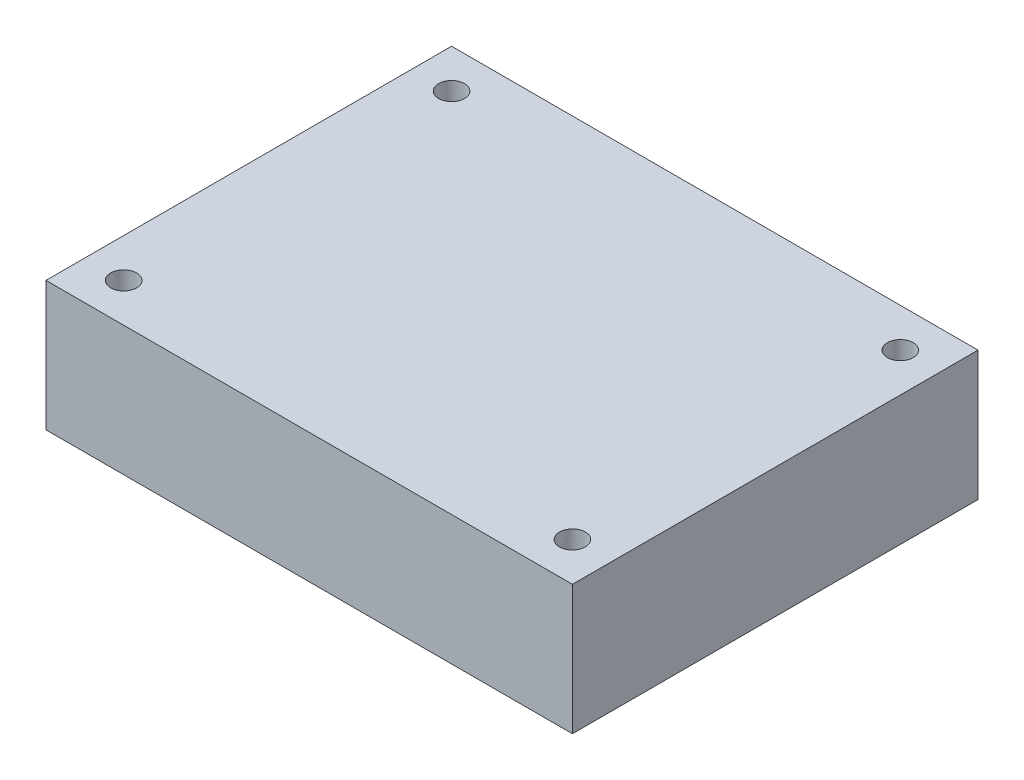
ISO-10303-21;
HEADER;
FILE_DESCRIPTION(('STEP AP214'),'2;1');
FILE_NAME('part.step','',(''),(''),'','','');
FILE_SCHEMA(('AUTOMOTIVE_DESIGN { 1 0 10303 214 1 1 1 1 }'));
ENDSEC;
DATA;
#1=APPLICATION_CONTEXT('core data for automotive mechanical design processes');
#2=APPLICATION_PROTOCOL_DEFINITION('international standard','automotive_design',2000,#1);
#3=PRODUCT_CONTEXT('',#1,'mechanical');
#4=PRODUCT('Part','Part','',(#3));
#5=PRODUCT_RELATED_PRODUCT_CATEGORY('part','',(#4));
#6=PRODUCT_DEFINITION_FORMATION('','',#4);
#7=PRODUCT_DEFINITION_CONTEXT('part definition',#1,'design');
#8=PRODUCT_DEFINITION('design','',#6,#7);
#9=PRODUCT_DEFINITION_SHAPE('','',#8);
#10=(LENGTH_UNIT() NAMED_UNIT(*) SI_UNIT(.MILLI.,.METRE.));
#11=(NAMED_UNIT(*) PLANE_ANGLE_UNIT() SI_UNIT($,.RADIAN.));
#12=(NAMED_UNIT(*) SI_UNIT($,.STERADIAN.) SOLID_ANGLE_UNIT());
#13=UNCERTAINTY_MEASURE_WITH_UNIT(LENGTH_MEASURE(1.E-05),#10,'distance_accuracy_value','');
#14=(GEOMETRIC_REPRESENTATION_CONTEXT(3) GLOBAL_UNCERTAINTY_ASSIGNED_CONTEXT((#13)) GLOBAL_UNIT_ASSIGNED_CONTEXT((#10,
#11,#12)) REPRESENTATION_CONTEXT('',''));
#15=CARTESIAN_POINT('',(0.,0.,0.));
#16=DIRECTION('',(0.,0.,1.));
#17=DIRECTION('',(1.,0.,0.));
#18=AXIS2_PLACEMENT_3D('',#15,#16,#17);
#19=CARTESIAN_POINT('',(0.,15.,0.));
#20=DIRECTION('',(0.,-1.,0.));
#21=DIRECTION('',(0.,0.,-1.));
#22=AXIS2_PLACEMENT_3D('',#19,#20,#21);
#23=PLANE('',#22);
#24=DIRECTION('',(0.,0.,1.));
#25=VECTOR('',#24,1.);
#26=CARTESIAN_POINT('',(0.,15.,0.));
#27=LINE('',#26,#25);
#28=CARTESIAN_POINT('',(0.,15.,-47.));
#29=VERTEX_POINT('',#28);
#30=CARTESIAN_POINT('',(0.,15.,0.));
#31=VERTEX_POINT('',#30);
#32=EDGE_CURVE('E93',#29,#31,#27,.T.);
#33=ORIENTED_EDGE('',*,*,#32,.T.);
#34=DIRECTION('',(1.,0.,0.));
#35=VECTOR('',#34,1.);
#36=CARTESIAN_POINT('',(0.,15.,0.));
#37=LINE('',#36,#35);
#38=CARTESIAN_POINT('',(61.,15.,0.));
#39=VERTEX_POINT('',#38);
#40=EDGE_CURVE('E88',#31,#39,#37,.T.);
#41=ORIENTED_EDGE('',*,*,#40,.T.);
#42=DIRECTION('',(0.,0.,-1.));
#43=VECTOR('',#42,1.);
#44=CARTESIAN_POINT('',(61.,15.,0.));
#45=LINE('',#44,#43);
#46=CARTESIAN_POINT('',(61.,15.,-47.));
#47=VERTEX_POINT('',#46);
#48=EDGE_CURVE('E91',#39,#47,#45,.T.);
#49=ORIENTED_EDGE('',*,*,#48,.T.);
#50=DIRECTION('',(-1.,0.,0.));
#51=VECTOR('',#50,1.);
#52=CARTESIAN_POINT('',(0.,15.,-47.));
#53=LINE('',#52,#51);
#54=EDGE_CURVE('E58',#47,#29,#53,.T.);
#55=ORIENTED_EDGE('',*,*,#54,.T.);
#56=EDGE_LOOP('',(#33,#41,#49,#55));
#57=FACE_BOUND('',#56,.T.);
#58=CARTESIAN_POINT('',(4.5,15.,-42.5));
#59=DIRECTION('',(0.,1.,0.));
#60=DIRECTION('',(0.,0.,1.));
#61=AXIS2_PLACEMENT_3D('',#58,#59,#60);
#62=CIRCLE('',#61,1.5);
#63=CARTESIAN_POINT('',(4.5,15.,-41.));
#64=VERTEX_POINT('',#63);
#65=EDGE_CURVE('E108',#64,#64,#62,.T.);
#66=ORIENTED_EDGE('',*,*,#65,.F.);
#67=EDGE_LOOP('',(#66));
#68=FACE_BOUND('',#67,.T.);
#69=CARTESIAN_POINT('',(56.5,15.,-42.5));
#70=DIRECTION('',(0.,1.,0.));
#71=DIRECTION('',(0.,0.,1.));
#72=AXIS2_PLACEMENT_3D('',#69,#70,#71);
#73=CIRCLE('',#72,1.50107981201165);
#74=CARTESIAN_POINT('',(56.5,15.,-40.9989201879884));
#75=VERTEX_POINT('',#74);
#76=EDGE_CURVE('E123',#75,#75,#73,.T.);
#77=ORIENTED_EDGE('',*,*,#76,.F.);
#78=EDGE_LOOP('',(#77));
#79=FACE_BOUND('',#78,.T.);
#80=CARTESIAN_POINT('',(56.5,15.,-4.5));
#81=DIRECTION('',(0.,1.,0.));
#82=DIRECTION('',(0.,0.,1.));
#83=AXIS2_PLACEMENT_3D('',#80,#81,#82);
#84=CIRCLE('',#83,1.5);
#85=CARTESIAN_POINT('',(56.5,15.,-3.));
#86=VERTEX_POINT('',#85);
#87=EDGE_CURVE('E129',#86,#86,#84,.T.);
#88=ORIENTED_EDGE('',*,*,#87,.F.);
#89=EDGE_LOOP('',(#88));
#90=FACE_BOUND('',#89,.T.);
#91=CARTESIAN_POINT('',(4.5,15.,-4.5));
#92=DIRECTION('',(0.,1.,0.));
#93=DIRECTION('',(0.,0.,1.));
#94=AXIS2_PLACEMENT_3D('',#91,#92,#93);
#95=CIRCLE('',#94,1.5);
#96=CARTESIAN_POINT('',(4.5,15.,-3.));
#97=VERTEX_POINT('',#96);
#98=EDGE_CURVE('E135',#97,#97,#95,.T.);
#99=ORIENTED_EDGE('',*,*,#98,.F.);
#100=EDGE_LOOP('',(#99));
#101=FACE_BOUND('',#100,.T.);
#102=ADVANCED_FACE('F41',(#57,#68,#79,#90,#101),#23,.F.);
#103=CARTESIAN_POINT('',(0.,0.,0.));
#104=DIRECTION('',(0.,-1.,0.));
#105=DIRECTION('',(0.,0.,-1.));
#106=AXIS2_PLACEMENT_3D('',#103,#104,#105);
#107=PLANE('',#106);
#108=CARTESIAN_POINT('',(56.5,0.,-4.5));
#109=DIRECTION('',(0.,1.,0.));
#110=DIRECTION('',(0.,0.,1.));
#111=AXIS2_PLACEMENT_3D('',#108,#109,#110);
#112=CIRCLE('',#111,1.5);
#113=CARTESIAN_POINT('',(56.5,0.,-3.));
#114=VERTEX_POINT('',#113);
#115=EDGE_CURVE('E132',#114,#114,#112,.T.);
#116=ORIENTED_EDGE('',*,*,#115,.T.);
#117=EDGE_LOOP('',(#116));
#118=FACE_BOUND('',#117,.T.);
#119=CARTESIAN_POINT('',(4.5,0.,-42.5));
#120=DIRECTION('',(0.,1.,0.));
#121=DIRECTION('',(0.,0.,1.));
#122=AXIS2_PLACEMENT_3D('',#119,#120,#121);
#123=CIRCLE('',#122,1.5);
#124=CARTESIAN_POINT('',(4.5,0.,-41.));
#125=VERTEX_POINT('',#124);
#126=EDGE_CURVE('E120',#125,#125,#123,.T.);
#127=ORIENTED_EDGE('',*,*,#126,.T.);
#128=EDGE_LOOP('',(#127));
#129=FACE_BOUND('',#128,.T.);
#130=DIRECTION('',(0.,0.,1.));
#131=VECTOR('',#130,1.);
#132=CARTESIAN_POINT('',(0.,0.,0.));
#133=LINE('',#132,#131);
#134=CARTESIAN_POINT('',(0.,0.,-47.));
#135=VERTEX_POINT('',#134);
#136=CARTESIAN_POINT('',(0.,0.,0.));
#137=VERTEX_POINT('',#136);
#138=EDGE_CURVE('E105',#135,#137,#133,.T.);
#139=ORIENTED_EDGE('',*,*,#138,.F.);
#140=DIRECTION('',(-1.,0.,0.));
#141=VECTOR('',#140,1.);
#142=CARTESIAN_POINT('',(0.,0.,-47.));
#143=LINE('',#142,#141);
#144=CARTESIAN_POINT('',(61.,0.,-47.));
#145=VERTEX_POINT('',#144);
#146=EDGE_CURVE('E81',#145,#135,#143,.T.);
#147=ORIENTED_EDGE('',*,*,#146,.F.);
#148=DIRECTION('',(0.,0.,-1.));
#149=VECTOR('',#148,1.);
#150=CARTESIAN_POINT('',(61.,0.,0.));
#151=LINE('',#150,#149);
#152=CARTESIAN_POINT('',(61.,0.,0.));
#153=VERTEX_POINT('',#152);
#154=EDGE_CURVE('E75',#153,#145,#151,.T.);
#155=ORIENTED_EDGE('',*,*,#154,.F.);
#156=DIRECTION('',(1.,0.,0.));
#157=VECTOR('',#156,1.);
#158=CARTESIAN_POINT('',(0.,0.,0.));
#159=LINE('',#158,#157);
#160=EDGE_CURVE('E97',#137,#153,#159,.T.);
#161=ORIENTED_EDGE('',*,*,#160,.F.);
#162=EDGE_LOOP('',(#139,#147,#155,#161));
#163=FACE_BOUND('',#162,.T.);
#164=CARTESIAN_POINT('',(56.5,0.,-42.5));
#165=DIRECTION('',(0.,1.,0.));
#166=DIRECTION('',(0.,0.,1.));
#167=AXIS2_PLACEMENT_3D('',#164,#165,#166);
#168=CIRCLE('',#167,1.50107981201165);
#169=CARTESIAN_POINT('',(56.5,0.,-40.9989201879884));
#170=VERTEX_POINT('',#169);
#171=EDGE_CURVE('E126',#170,#170,#168,.T.);
#172=ORIENTED_EDGE('',*,*,#171,.T.);
#173=EDGE_LOOP('',(#172));
#174=FACE_BOUND('',#173,.T.);
#175=CARTESIAN_POINT('',(4.5,0.,-4.5));
#176=DIRECTION('',(0.,1.,0.));
#177=DIRECTION('',(0.,0.,1.));
#178=AXIS2_PLACEMENT_3D('',#175,#176,#177);
#179=CIRCLE('',#178,1.5);
#180=CARTESIAN_POINT('',(4.5,0.,-3.));
#181=VERTEX_POINT('',#180);
#182=EDGE_CURVE('E138',#181,#181,#179,.T.);
#183=ORIENTED_EDGE('',*,*,#182,.T.);
#184=EDGE_LOOP('',(#183));
#185=FACE_BOUND('',#184,.T.);
#186=ADVANCED_FACE('F116',(#118,#129,#163,#174,#185),#107,.T.);
#187=CARTESIAN_POINT('',(0.,15.,0.));
#188=DIRECTION('',(1.,0.,0.));
#189=DIRECTION('',(0.,0.,-1.));
#190=AXIS2_PLACEMENT_3D('',#187,#188,#189);
#191=PLANE('',#190);
#192=ORIENTED_EDGE('',*,*,#138,.T.);
#193=DIRECTION('',(0.,-1.,0.));
#194=VECTOR('',#193,1.);
#195=CARTESIAN_POINT('',(0.,15.,0.));
#196=LINE('',#195,#194);
#197=EDGE_CURVE('E11',#31,#137,#196,.T.);
#198=ORIENTED_EDGE('',*,*,#197,.F.);
#199=ORIENTED_EDGE('',*,*,#32,.F.);
#200=DIRECTION('',(0.,-1.,0.));
#201=VECTOR('',#200,1.);
#202=CARTESIAN_POINT('',(0.,15.,-47.));
#203=LINE('',#202,#201);
#204=EDGE_CURVE('E101',#29,#135,#203,.T.);
#205=ORIENTED_EDGE('',*,*,#204,.T.);
#206=EDGE_LOOP('',(#192,#198,#199,#205));
#207=FACE_BOUND('',#206,.T.);
#208=ADVANCED_FACE('F43',(#207),#191,.F.);
#209=CARTESIAN_POINT('',(0.,15.,0.));
#210=DIRECTION('',(0.,0.,-1.));
#211=DIRECTION('',(-1.,0.,0.));
#212=AXIS2_PLACEMENT_3D('',#209,#210,#211);
#213=PLANE('',#212);
#214=ORIENTED_EDGE('',*,*,#160,.T.);
#215=DIRECTION('',(0.,-1.,0.));
#216=VECTOR('',#215,1.);
#217=CARTESIAN_POINT('',(61.,15.,0.));
#218=LINE('',#217,#216);
#219=EDGE_CURVE('E50',#39,#153,#218,.T.);
#220=ORIENTED_EDGE('',*,*,#219,.F.);
#221=ORIENTED_EDGE('',*,*,#40,.F.);
#222=ORIENTED_EDGE('',*,*,#197,.T.);
#223=EDGE_LOOP('',(#214,#220,#221,#222));
#224=FACE_BOUND('',#223,.T.);
#225=ADVANCED_FACE('F96',(#224),#213,.F.);
#226=CARTESIAN_POINT('',(61.,15.,0.));
#227=DIRECTION('',(-1.,0.,0.));
#228=DIRECTION('',(0.,0.,1.));
#229=AXIS2_PLACEMENT_3D('',#226,#227,#228);
#230=PLANE('',#229);
#231=ORIENTED_EDGE('',*,*,#154,.T.);
#232=DIRECTION('',(0.,-1.,0.));
#233=VECTOR('',#232,1.);
#234=CARTESIAN_POINT('',(61.,15.,-47.));
#235=LINE('',#234,#233);
#236=EDGE_CURVE('E98',#47,#145,#235,.T.);
#237=ORIENTED_EDGE('',*,*,#236,.F.);
#238=ORIENTED_EDGE('',*,*,#48,.F.);
#239=ORIENTED_EDGE('',*,*,#219,.T.);
#240=EDGE_LOOP('',(#231,#237,#238,#239));
#241=FACE_BOUND('',#240,.T.);
#242=ADVANCED_FACE('F99',(#241),#230,.F.);
#243=CARTESIAN_POINT('',(0.,15.,-47.));
#244=DIRECTION('',(0.,0.,1.));
#245=DIRECTION('',(1.,0.,0.));
#246=AXIS2_PLACEMENT_3D('',#243,#244,#245);
#247=PLANE('',#246);
#248=ORIENTED_EDGE('',*,*,#146,.T.);
#249=ORIENTED_EDGE('',*,*,#204,.F.);
#250=ORIENTED_EDGE('',*,*,#54,.F.);
#251=ORIENTED_EDGE('',*,*,#236,.T.);
#252=EDGE_LOOP('',(#248,#249,#250,#251));
#253=FACE_BOUND('',#252,.T.);
#254=ADVANCED_FACE('F113',(#253),#247,.F.);
#255=CARTESIAN_POINT('',(4.5,15.,-42.5));
#256=DIRECTION('',(0.,-1.,0.));
#257=DIRECTION('',(0.,0.,-1.));
#258=AXIS2_PLACEMENT_3D('',#255,#256,#257);
#259=CYLINDRICAL_SURFACE('',#258,1.5);
#260=ORIENTED_EDGE('',*,*,#65,.T.);
#261=EDGE_LOOP('',(#260));
#262=FACE_BOUND('',#261,.T.);
#263=ORIENTED_EDGE('',*,*,#126,.F.);
#264=EDGE_LOOP('',(#263));
#265=FACE_BOUND('',#264,.T.);
#266=ADVANCED_FACE('F155',(#262,#265),#259,.F.);
#267=CARTESIAN_POINT('',(56.5,15.,-42.5));
#268=DIRECTION('',(0.,-1.,0.));
#269=DIRECTION('',(0.,0.,-1.));
#270=AXIS2_PLACEMENT_3D('',#267,#268,#269);
#271=CYLINDRICAL_SURFACE('',#270,1.50107981201165);
#272=ORIENTED_EDGE('',*,*,#76,.T.);
#273=EDGE_LOOP('',(#272));
#274=FACE_BOUND('',#273,.T.);
#275=ORIENTED_EDGE('',*,*,#171,.F.);
#276=EDGE_LOOP('',(#275));
#277=FACE_BOUND('',#276,.T.);
#278=ADVANCED_FACE('F200',(#274,#277),#271,.F.);
#279=CARTESIAN_POINT('',(56.5,15.,-4.5));
#280=DIRECTION('',(0.,-1.,0.));
#281=DIRECTION('',(0.,0.,-1.));
#282=AXIS2_PLACEMENT_3D('',#279,#280,#281);
#283=CYLINDRICAL_SURFACE('',#282,1.5);
#284=ORIENTED_EDGE('',*,*,#87,.T.);
#285=EDGE_LOOP('',(#284));
#286=FACE_BOUND('',#285,.T.);
#287=ORIENTED_EDGE('',*,*,#115,.F.);
#288=EDGE_LOOP('',(#287));
#289=FACE_BOUND('',#288,.T.);
#290=ADVANCED_FACE('F208',(#286,#289),#283,.F.);
#291=CARTESIAN_POINT('',(4.5,15.,-4.5));
#292=DIRECTION('',(0.,-1.,0.));
#293=DIRECTION('',(0.,0.,-1.));
#294=AXIS2_PLACEMENT_3D('',#291,#292,#293);
#295=CYLINDRICAL_SURFACE('',#294,1.5);
#296=ORIENTED_EDGE('',*,*,#98,.T.);
#297=EDGE_LOOP('',(#296));
#298=FACE_BOUND('',#297,.T.);
#299=ORIENTED_EDGE('',*,*,#182,.F.);
#300=EDGE_LOOP('',(#299));
#301=FACE_BOUND('',#300,.T.);
#302=ADVANCED_FACE('F144',(#298,#301),#295,.F.);
#303=CLOSED_SHELL('',(#102,#186,#208,#225,#242,#254,#266,#278,#290,#302));
#304=MANIFOLD_SOLID_BREP('B2',#303);
#305=ADVANCED_BREP_SHAPE_REPRESENTATION('',(#18,#304),#14);
#306=SHAPE_DEFINITION_REPRESENTATION(#9,#305);
ENDSEC;
END-ISO-10303-21;
